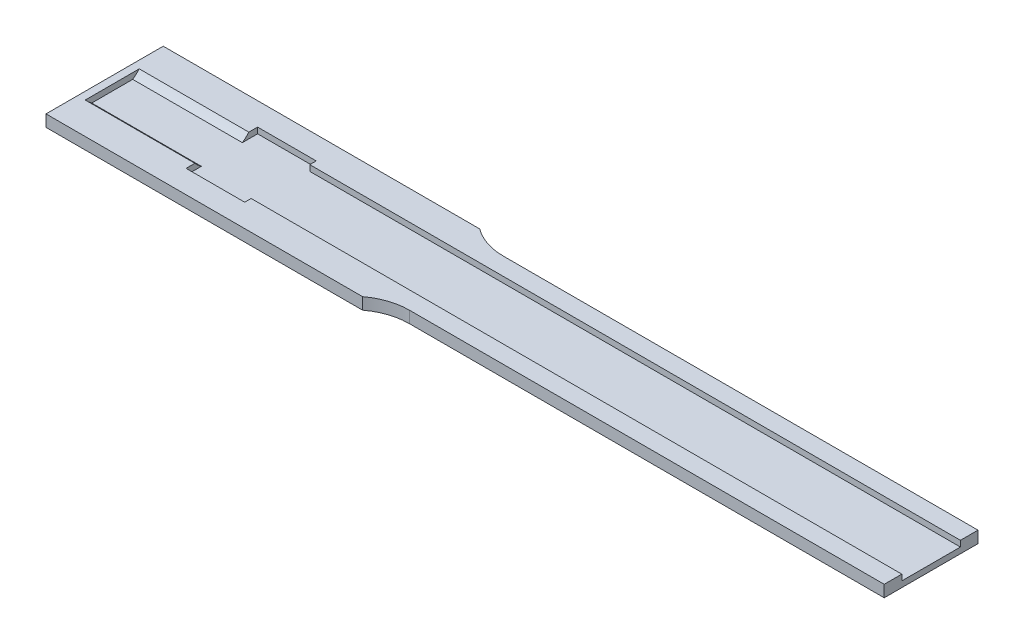
ISO-10303-21;
HEADER;
FILE_DESCRIPTION(('STEP AP214'),'2;1');
FILE_NAME('part.step','',(''),(''),'','','');
FILE_SCHEMA(('AUTOMOTIVE_DESIGN { 1 0 10303 214 1 1 1 1 }'));
ENDSEC;
DATA;
#1=APPLICATION_CONTEXT('core data for automotive mechanical design processes');
#2=APPLICATION_PROTOCOL_DEFINITION('international standard','automotive_design',2000,#1);
#3=PRODUCT_CONTEXT('',#1,'mechanical');
#4=PRODUCT('Part','Part','',(#3));
#5=PRODUCT_RELATED_PRODUCT_CATEGORY('part','',(#4));
#6=PRODUCT_DEFINITION_FORMATION('','',#4);
#7=PRODUCT_DEFINITION_CONTEXT('part definition',#1,'design');
#8=PRODUCT_DEFINITION('design','',#6,#7);
#9=PRODUCT_DEFINITION_SHAPE('','',#8);
#10=(LENGTH_UNIT() NAMED_UNIT(*) SI_UNIT(.MILLI.,.METRE.));
#11=(NAMED_UNIT(*) PLANE_ANGLE_UNIT() SI_UNIT($,.RADIAN.));
#12=(NAMED_UNIT(*) SI_UNIT($,.STERADIAN.) SOLID_ANGLE_UNIT());
#13=UNCERTAINTY_MEASURE_WITH_UNIT(LENGTH_MEASURE(1.E-05),#10,'distance_accuracy_value','');
#14=(GEOMETRIC_REPRESENTATION_CONTEXT(3) GLOBAL_UNCERTAINTY_ASSIGNED_CONTEXT((#13)) GLOBAL_UNIT_ASSIGNED_CONTEXT((#10,
#11,#12)) REPRESENTATION_CONTEXT('',''));
#15=CARTESIAN_POINT('',(0.,0.,0.));
#16=DIRECTION('',(0.,0.,1.));
#17=DIRECTION('',(1.,0.,0.));
#18=AXIS2_PLACEMENT_3D('',#15,#16,#17);
#19=CARTESIAN_POINT('',(0.,6.,0.));
#20=DIRECTION('',(1.,0.,0.));
#21=DIRECTION('',(0.,0.,-1.));
#22=AXIS2_PLACEMENT_3D('',#19,#20,#21);
#23=PLANE('',#22);
#24=DIRECTION('',(0.,0.,1.));
#25=VECTOR('',#24,1.);
#26=CARTESIAN_POINT('',(0.,-6.,10.));
#27=LINE('',#26,#25);
#28=CARTESIAN_POINT('',(0.,-6.,-10.));
#29=VERTEX_POINT('',#28);
#30=CARTESIAN_POINT('',(0.,-6.,10.));
#31=VERTEX_POINT('',#30);
#32=EDGE_CURVE('E185',#29,#31,#27,.T.);
#33=ORIENTED_EDGE('',*,*,#32,.T.);
#34=DIRECTION('',(0.,-1.,0.));
#35=VECTOR('',#34,1.);
#36=CARTESIAN_POINT('',(0.,6.,10.));
#37=LINE('',#36,#35);
#38=CARTESIAN_POINT('',(0.,-4.,10.));
#39=VERTEX_POINT('',#38);
#40=EDGE_CURVE('E196',#39,#31,#37,.T.);
#41=ORIENTED_EDGE('',*,*,#40,.F.);
#42=DIRECTION('',(0.,0.,1.));
#43=VECTOR('',#42,1.);
#44=CARTESIAN_POINT('',(0.,-4.,0.));
#45=LINE('',#44,#43);
#46=CARTESIAN_POINT('',(0.,-4.,-10.));
#47=VERTEX_POINT('',#46);
#48=EDGE_CURVE('E194',#47,#39,#45,.T.);
#49=ORIENTED_EDGE('',*,*,#48,.F.);
#50=DIRECTION('',(0.,-1.,0.));
#51=VECTOR('',#50,1.);
#52=CARTESIAN_POINT('',(0.,6.,-10.));
#53=LINE('',#52,#51);
#54=EDGE_CURVE('E179',#47,#29,#53,.T.);
#55=ORIENTED_EDGE('',*,*,#54,.T.);
#56=EDGE_LOOP('',(#33,#41,#49,#55));
#57=FACE_BOUND('',#56,.T.);
#58=ADVANCED_FACE('F38',(#57),#23,.F.);
#59=CARTESIAN_POINT('',(0.,6.,10.));
#60=DIRECTION('',(0.,0.,1.));
#61=DIRECTION('',(1.,0.,0.));
#62=AXIS2_PLACEMENT_3D('',#59,#60,#61);
#63=PLANE('',#62);
#64=ORIENTED_EDGE('',*,*,#40,.T.);
#65=DIRECTION('',(-1.,0.,0.));
#66=VECTOR('',#65,1.);
#67=CARTESIAN_POINT('',(0.,-6.,10.));
#68=LINE('',#67,#66);
#69=CARTESIAN_POINT('',(54.,-6.,10.));
#70=VERTEX_POINT('',#69);
#71=EDGE_CURVE('E188',#70,#31,#68,.T.);
#72=ORIENTED_EDGE('',*,*,#71,.F.);
#73=DIRECTION('',(0.,1.,0.));
#74=VECTOR('',#73,1.);
#75=CARTESIAN_POINT('',(54.,-8.001,10.));
#76=LINE('',#75,#74);
#77=CARTESIAN_POINT('',(54.,-4.,10.));
#78=VERTEX_POINT('',#77);
#79=EDGE_CURVE('E219',#70,#78,#76,.T.);
#80=ORIENTED_EDGE('',*,*,#79,.T.);
#81=DIRECTION('',(-1.,0.,0.));
#82=VECTOR('',#81,1.);
#83=CARTESIAN_POINT('',(141.,-4.,10.));
#84=LINE('',#83,#82);
#85=EDGE_CURVE('E354',#78,#39,#84,.T.);
#86=ORIENTED_EDGE('',*,*,#85,.T.);
#87=EDGE_LOOP('',(#64,#72,#80,#86));
#88=FACE_BOUND('',#87,.T.);
#89=ADVANCED_FACE('F217',(#88),#63,.T.);
#90=CARTESIAN_POINT('',(0.,6.,-10.));
#91=DIRECTION('',(0.,0.,-1.));
#92=DIRECTION('',(-1.,0.,0.));
#93=AXIS2_PLACEMENT_3D('',#90,#91,#92);
#94=PLANE('',#93);
#95=DIRECTION('',(1.,0.,0.));
#96=VECTOR('',#95,1.);
#97=CARTESIAN_POINT('',(0.,-6.,-10.));
#98=LINE('',#97,#96);
#99=CARTESIAN_POINT('',(54.,-6.,-10.));
#100=VERTEX_POINT('',#99);
#101=EDGE_CURVE('E174',#29,#100,#98,.T.);
#102=ORIENTED_EDGE('',*,*,#101,.F.);
#103=ORIENTED_EDGE('',*,*,#54,.F.);
#104=DIRECTION('',(-1.,0.,0.));
#105=VECTOR('',#104,1.);
#106=CARTESIAN_POINT('',(141.,-4.,-10.));
#107=LINE('',#106,#105);
#108=CARTESIAN_POINT('',(54.,-4.,-10.));
#109=VERTEX_POINT('',#108);
#110=EDGE_CURVE('E352',#109,#47,#107,.T.);
#111=ORIENTED_EDGE('',*,*,#110,.F.);
#112=DIRECTION('',(0.,1.,0.));
#113=VECTOR('',#112,1.);
#114=CARTESIAN_POINT('',(54.,-8.001,-10.));
#115=LINE('',#114,#113);
#116=EDGE_CURVE('E181',#100,#109,#115,.T.);
#117=ORIENTED_EDGE('',*,*,#116,.F.);
#118=EDGE_LOOP('',(#102,#103,#111,#117));
#119=FACE_BOUND('',#118,.T.);
#120=ADVANCED_FACE('F176',(#119),#94,.T.);
#121=CARTESIAN_POINT('',(30.,0.,0.));
#122=DIRECTION('',(-1.,0.,0.));
#123=DIRECTION('',(0.,0.,1.));
#124=AXIS2_PLACEMENT_3D('',#121,#122,#123);
#125=PLANE('',#124);
#126=DIRECTION('',(0.,-1.,0.));
#127=VECTOR('',#126,1.);
#128=CARTESIAN_POINT('',(30.,-1.,-5.));
#129=LINE('',#128,#127);
#130=CARTESIAN_POINT('',(30.,-4.,-5.));
#131=VERTEX_POINT('',#130);
#132=CARTESIAN_POINT('',(30.,-5.,-5.));
#133=VERTEX_POINT('',#132);
#134=EDGE_CURVE('E317',#131,#133,#129,.T.);
#135=ORIENTED_EDGE('',*,*,#134,.F.);
#136=DIRECTION('',(0.,0.,-1.));
#137=VECTOR('',#136,1.);
#138=CARTESIAN_POINT('',(30.,-4.,0.));
#139=LINE('',#138,#137);
#140=CARTESIAN_POINT('',(30.,-4.,-6.1));
#141=VERTEX_POINT('',#140);
#142=EDGE_CURVE('E52',#131,#141,#139,.T.);
#143=ORIENTED_EDGE('',*,*,#142,.T.);
#144=DIRECTION('',(0.,-1.,0.));
#145=VECTOR('',#144,1.);
#146=CARTESIAN_POINT('',(30.,6.,-6.1));
#147=LINE('',#146,#145);
#148=CARTESIAN_POINT('',(30.,-5.,-6.1));
#149=VERTEX_POINT('',#148);
#150=EDGE_CURVE('E244',#141,#149,#147,.T.);
#151=ORIENTED_EDGE('',*,*,#150,.T.);
#152=DIRECTION('',(0.,0.,1.));
#153=VECTOR('',#152,1.);
#154=CARTESIAN_POINT('',(30.,-5.,-6.1));
#155=LINE('',#154,#153);
#156=EDGE_CURVE('E248',#149,#133,#155,.T.);
#157=ORIENTED_EDGE('',*,*,#156,.T.);
#158=EDGE_LOOP('',(#135,#143,#151,#157));
#159=FACE_BOUND('',#158,.T.);
#160=ADVANCED_FACE('F393',(#159),#125,.T.);
#161=CARTESIAN_POINT('',(1.3,0.,0.));
#162=DIRECTION('',(1.,0.,0.));
#163=DIRECTION('',(0.,0.,-1.));
#164=AXIS2_PLACEMENT_3D('',#161,#162,#163);
#165=PLANE('',#164);
#166=CARTESIAN_POINT('',(1.3,0.,0.));
#167=DIRECTION('',(1.,0.,0.));
#168=DIRECTION('',(0.,0.,-1.));
#169=AXIS2_PLACEMENT_3D('',#166,#167,#168);
#170=CIRCLE('',#169,6.09999999999998);
#171=CARTESIAN_POINT('',(1.3,-5.,-3.49428104193123));
#172=VERTEX_POINT('',#171);
#173=CARTESIAN_POINT('',(1.3,-4.,-4.60543157586778));
#174=VERTEX_POINT('',#173);
#175=EDGE_CURVE('E234',#172,#174,#170,.T.);
#176=ORIENTED_EDGE('',*,*,#175,.T.);
#177=DIRECTION('',(0.,0.,1.));
#178=VECTOR('',#177,1.);
#179=CARTESIAN_POINT('',(1.3,-4.,0.));
#180=LINE('',#179,#178);
#181=CARTESIAN_POINT('',(1.3,-4.,4.60543157586776));
#182=VERTEX_POINT('',#181);
#183=EDGE_CURVE('E365',#174,#182,#180,.T.);
#184=ORIENTED_EDGE('',*,*,#183,.T.);
#185=CARTESIAN_POINT('',(1.3,0.,0.));
#186=DIRECTION('',(1.,0.,0.));
#187=DIRECTION('',(0.,0.,-1.));
#188=AXIS2_PLACEMENT_3D('',#185,#186,#187);
#189=CIRCLE('',#188,6.09999999999998);
#190=CARTESIAN_POINT('',(1.3,-5.,3.49428104193123));
#191=VERTEX_POINT('',#190);
#192=EDGE_CURVE('E237',#182,#191,#189,.T.);
#193=ORIENTED_EDGE('',*,*,#192,.T.);
#194=DIRECTION('',(0.,0.,-1.));
#195=VECTOR('',#194,1.);
#196=CARTESIAN_POINT('',(1.3,-5.,-3.49428104193123));
#197=LINE('',#196,#195);
#198=EDGE_CURVE('E240',#191,#172,#197,.T.);
#199=ORIENTED_EDGE('',*,*,#198,.T.);
#200=EDGE_LOOP('',(#176,#184,#193,#199));
#201=FACE_BOUND('',#200,.T.);
#202=ADVANCED_FACE('F373',(#201),#165,.T.);
#203=CARTESIAN_POINT('',(141.,6.,0.));
#204=DIRECTION('',(1.,0.,0.));
#205=DIRECTION('',(0.,0.,-1.));
#206=AXIS2_PLACEMENT_3D('',#203,#204,#205);
#207=PLANE('',#206);
#208=DIRECTION('',(0.,1.,0.));
#209=VECTOR('',#208,1.);
#210=CARTESIAN_POINT('',(141.,-8.001,-8.));
#211=LINE('',#210,#209);
#212=CARTESIAN_POINT('',(141.,-6.,-8.));
#213=VERTEX_POINT('',#212);
#214=CARTESIAN_POINT('',(141.,-4.,-8.));
#215=VERTEX_POINT('',#214);
#216=EDGE_CURVE('E238',#213,#215,#211,.T.);
#217=ORIENTED_EDGE('',*,*,#216,.T.);
#218=DIRECTION('',(0.,0.,-1.));
#219=VECTOR('',#218,1.);
#220=CARTESIAN_POINT('',(141.,-4.,-10.));
#221=LINE('',#220,#219);
#222=CARTESIAN_POINT('',(141.,-4.,-5.));
#223=VERTEX_POINT('',#222);
#224=EDGE_CURVE('E192',#223,#215,#221,.T.);
#225=ORIENTED_EDGE('',*,*,#224,.F.);
#226=DIRECTION('',(0.,-1.,0.));
#227=VECTOR('',#226,1.);
#228=CARTESIAN_POINT('',(141.,-1.,-5.));
#229=LINE('',#228,#227);
#230=CARTESIAN_POINT('',(141.,-5.,-5.));
#231=VERTEX_POINT('',#230);
#232=EDGE_CURVE('E318',#223,#231,#229,.T.);
#233=ORIENTED_EDGE('',*,*,#232,.T.);
#234=DIRECTION('',(0.,0.,1.));
#235=VECTOR('',#234,1.);
#236=CARTESIAN_POINT('',(141.,-5.,-5.));
#237=LINE('',#236,#235);
#238=CARTESIAN_POINT('',(141.,-5.,5.));
#239=VERTEX_POINT('',#238);
#240=EDGE_CURVE('E320',#231,#239,#237,.T.);
#241=ORIENTED_EDGE('',*,*,#240,.T.);
#242=DIRECTION('',(0.,1.,0.));
#243=VECTOR('',#242,1.);
#244=CARTESIAN_POINT('',(141.,-5.,5.));
#245=LINE('',#244,#243);
#246=CARTESIAN_POINT('',(141.,-4.,5.));
#247=VERTEX_POINT('',#246);
#248=EDGE_CURVE('E296',#239,#247,#245,.T.);
#249=ORIENTED_EDGE('',*,*,#248,.T.);
#250=CARTESIAN_POINT('',(141.,-4.,8.));
#251=VERTEX_POINT('',#250);
#252=EDGE_CURVE('E283',#251,#247,#221,.T.);
#253=ORIENTED_EDGE('',*,*,#252,.F.);
#254=DIRECTION('',(0.,1.,0.));
#255=VECTOR('',#254,1.);
#256=CARTESIAN_POINT('',(141.,-8.001,8.));
#257=LINE('',#256,#255);
#258=CARTESIAN_POINT('',(141.,-6.,8.));
#259=VERTEX_POINT('',#258);
#260=EDGE_CURVE('E226',#259,#251,#257,.T.);
#261=ORIENTED_EDGE('',*,*,#260,.F.);
#262=DIRECTION('',(0.,0.,1.));
#263=VECTOR('',#262,1.);
#264=CARTESIAN_POINT('',(141.,-6.,0.));
#265=LINE('',#264,#263);
#266=EDGE_CURVE('E182',#213,#259,#265,.T.);
#267=ORIENTED_EDGE('',*,*,#266,.F.);
#268=EDGE_LOOP('',(#217,#225,#233,#241,#249,#253,#261,#267));
#269=FACE_BOUND('',#268,.T.);
#270=ADVANCED_FACE('F279',(#269),#207,.T.);
#271=CARTESIAN_POINT('',(20.,0.,0.));
#272=DIRECTION('',(-1.,0.,0.));
#273=DIRECTION('',(0.,0.,1.));
#274=AXIS2_PLACEMENT_3D('',#271,#272,#273);
#275=CYLINDRICAL_SURFACE('',#274,6.1);
#276=DIRECTION('',(-1.,0.,0.));
#277=VECTOR('',#276,1.);
#278=CARTESIAN_POINT('',(20.,-4.,-4.60543157586778));
#279=LINE('',#278,#277);
#280=CARTESIAN_POINT('',(20.,-4.,-4.60543157586778));
#281=VERTEX_POINT('',#280);
#282=EDGE_CURVE('E363',#174,#281,#279,.F.);
#283=ORIENTED_EDGE('',*,*,#282,.F.);
#284=ORIENTED_EDGE('',*,*,#175,.F.);
#285=DIRECTION('',(-1.,0.,0.));
#286=VECTOR('',#285,1.);
#287=CARTESIAN_POINT('',(20.,-5.,-3.49428104193123));
#288=LINE('',#287,#286);
#289=CARTESIAN_POINT('',(20.,-5.,-3.49428104193123));
#290=VERTEX_POINT('',#289);
#291=EDGE_CURVE('E272',#290,#172,#288,.T.);
#292=ORIENTED_EDGE('',*,*,#291,.F.);
#293=CARTESIAN_POINT('',(20.,0.,0.));
#294=DIRECTION('',(-1.,0.,0.));
#295=DIRECTION('',(0.,0.,1.));
#296=AXIS2_PLACEMENT_3D('',#293,#294,#295);
#297=CIRCLE('',#296,6.1);
#298=EDGE_CURVE('E265',#281,#290,#297,.T.);
#299=ORIENTED_EDGE('',*,*,#298,.F.);
#300=EDGE_LOOP('',(#283,#284,#292,#299));
#301=FACE_BOUND('',#300,.T.);
#302=ADVANCED_FACE('F381',(#301),#275,.F.);
#303=CARTESIAN_POINT('',(20.,0.,-6.1));
#304=DIRECTION('',(0.,0.,-1.));
#305=DIRECTION('',(-1.,0.,0.));
#306=AXIS2_PLACEMENT_3D('',#303,#304,#305);
#307=PLANE('',#306);
#308=DIRECTION('',(1.,0.,0.));
#309=VECTOR('',#308,1.);
#310=CARTESIAN_POINT('',(20.,-4.,-6.1));
#311=LINE('',#310,#309);
#312=CARTESIAN_POINT('',(20.,-4.,-6.1));
#313=VERTEX_POINT('',#312);
#314=EDGE_CURVE('E359',#313,#141,#311,.T.);
#315=ORIENTED_EDGE('',*,*,#314,.F.);
#316=DIRECTION('',(0.,-1.,0.));
#317=VECTOR('',#316,1.);
#318=CARTESIAN_POINT('',(20.,6.,-6.1));
#319=LINE('',#318,#317);
#320=CARTESIAN_POINT('',(20.,-5.,-6.1));
#321=VERTEX_POINT('',#320);
#322=EDGE_CURVE('E243',#313,#321,#319,.T.);
#323=ORIENTED_EDGE('',*,*,#322,.T.);
#324=DIRECTION('',(-1.,0.,0.));
#325=VECTOR('',#324,1.);
#326=CARTESIAN_POINT('',(30.,-5.,-6.1));
#327=LINE('',#326,#325);
#328=EDGE_CURVE('E254',#149,#321,#327,.T.);
#329=ORIENTED_EDGE('',*,*,#328,.F.);
#330=ORIENTED_EDGE('',*,*,#150,.F.);
#331=EDGE_LOOP('',(#315,#323,#329,#330));
#332=FACE_BOUND('',#331,.T.);
#333=ADVANCED_FACE('F389',(#332),#307,.F.);
#334=CARTESIAN_POINT('',(20.,6.,6.1));
#335=DIRECTION('',(0.,0.,1.));
#336=DIRECTION('',(1.,0.,0.));
#337=AXIS2_PLACEMENT_3D('',#334,#335,#336);
#338=PLANE('',#337);
#339=DIRECTION('',(-1.,0.,0.));
#340=VECTOR('',#339,1.);
#341=CARTESIAN_POINT('',(20.,-4.,6.1));
#342=LINE('',#341,#340);
#343=CARTESIAN_POINT('',(30.,-4.,6.1));
#344=VERTEX_POINT('',#343);
#345=CARTESIAN_POINT('',(20.,-4.,6.1));
#346=VERTEX_POINT('',#345);
#347=EDGE_CURVE('E343',#344,#346,#342,.T.);
#348=ORIENTED_EDGE('',*,*,#347,.F.);
#349=DIRECTION('',(0.,1.,0.));
#350=VECTOR('',#349,1.);
#351=CARTESIAN_POINT('',(30.,-5.,6.1));
#352=LINE('',#351,#350);
#353=CARTESIAN_POINT('',(30.,-5.,6.1));
#354=VERTEX_POINT('',#353);
#355=EDGE_CURVE('E251',#354,#344,#352,.T.);
#356=ORIENTED_EDGE('',*,*,#355,.F.);
#357=DIRECTION('',(-1.,0.,0.));
#358=VECTOR('',#357,1.);
#359=CARTESIAN_POINT('',(30.,-5.,6.1));
#360=LINE('',#359,#358);
#361=CARTESIAN_POINT('',(20.,-5.,6.1));
#362=VERTEX_POINT('',#361);
#363=EDGE_CURVE('E262',#354,#362,#360,.T.);
#364=ORIENTED_EDGE('',*,*,#363,.T.);
#365=DIRECTION('',(0.,1.,0.));
#366=VECTOR('',#365,1.);
#367=CARTESIAN_POINT('',(20.,-5.,6.1));
#368=LINE('',#367,#366);
#369=EDGE_CURVE('E247',#362,#346,#368,.T.);
#370=ORIENTED_EDGE('',*,*,#369,.T.);
#371=EDGE_LOOP('',(#348,#356,#364,#370));
#372=FACE_BOUND('',#371,.T.);
#373=ADVANCED_FACE('F342',(#372),#338,.F.);
#374=CARTESIAN_POINT('',(20.,0.,0.));
#375=DIRECTION('',(-1.,0.,0.));
#376=DIRECTION('',(0.,0.,1.));
#377=AXIS2_PLACEMENT_3D('',#374,#375,#376);
#378=CYLINDRICAL_SURFACE('',#377,6.1);
#379=DIRECTION('',(-1.,0.,0.));
#380=VECTOR('',#379,1.);
#381=CARTESIAN_POINT('',(20.,-4.,4.60543157586778));
#382=LINE('',#381,#380);
#383=CARTESIAN_POINT('',(20.,-4.,4.60543157586778));
#384=VERTEX_POINT('',#383);
#385=EDGE_CURVE('E348',#384,#182,#382,.T.);
#386=ORIENTED_EDGE('',*,*,#385,.F.);
#387=CARTESIAN_POINT('',(20.,0.,0.));
#388=DIRECTION('',(-1.,0.,0.));
#389=DIRECTION('',(0.,0.,1.));
#390=AXIS2_PLACEMENT_3D('',#387,#388,#389);
#391=CIRCLE('',#390,6.1);
#392=CARTESIAN_POINT('',(20.,-5.,3.49428104193123));
#393=VERTEX_POINT('',#392);
#394=EDGE_CURVE('E269',#393,#384,#391,.T.);
#395=ORIENTED_EDGE('',*,*,#394,.F.);
#396=DIRECTION('',(-1.,0.,0.));
#397=VECTOR('',#396,1.);
#398=CARTESIAN_POINT('',(20.,-5.,3.49428104193123));
#399=LINE('',#398,#397);
#400=EDGE_CURVE('E220',#393,#191,#399,.T.);
#401=ORIENTED_EDGE('',*,*,#400,.T.);
#402=ORIENTED_EDGE('',*,*,#192,.F.);
#403=EDGE_LOOP('',(#386,#395,#401,#402));
#404=FACE_BOUND('',#403,.T.);
#405=ADVANCED_FACE('F375',(#404),#378,.F.);
#406=CARTESIAN_POINT('',(20.,0.,0.));
#407=DIRECTION('',(-1.,0.,0.));
#408=DIRECTION('',(0.,0.,1.));
#409=AXIS2_PLACEMENT_3D('',#406,#407,#408);
#410=PLANE('',#409);
#411=DIRECTION('',(0.,0.,-1.));
#412=VECTOR('',#411,1.);
#413=CARTESIAN_POINT('',(20.,-4.,0.));
#414=LINE('',#413,#412);
#415=EDGE_CURVE('E361',#281,#313,#414,.T.);
#416=ORIENTED_EDGE('',*,*,#415,.F.);
#417=ORIENTED_EDGE('',*,*,#298,.T.);
#418=DIRECTION('',(0.,0.,1.));
#419=VECTOR('',#418,1.);
#420=CARTESIAN_POINT('',(20.,-5.,-6.1));
#421=LINE('',#420,#419);
#422=EDGE_CURVE('E257',#321,#290,#421,.T.);
#423=ORIENTED_EDGE('',*,*,#422,.F.);
#424=ORIENTED_EDGE('',*,*,#322,.F.);
#425=EDGE_LOOP('',(#416,#417,#423,#424));
#426=FACE_BOUND('',#425,.T.);
#427=ADVANCED_FACE('F386',(#426),#410,.F.);
#428=DIRECTION('',(0.,0.,-1.));
#429=VECTOR('',#428,1.);
#430=CARTESIAN_POINT('',(20.,-4.,0.));
#431=LINE('',#430,#429);
#432=EDGE_CURVE('E345',#346,#384,#431,.T.);
#433=ORIENTED_EDGE('',*,*,#432,.F.);
#434=ORIENTED_EDGE('',*,*,#369,.F.);
#435=EDGE_CURVE('E256',#393,#362,#421,.T.);
#436=ORIENTED_EDGE('',*,*,#435,.F.);
#437=ORIENTED_EDGE('',*,*,#394,.T.);
#438=EDGE_LOOP('',(#433,#434,#436,#437));
#439=FACE_BOUND('',#438,.T.);
#440=ADVANCED_FACE('F404',(#439),#410,.F.);
#441=ORIENTED_EDGE('',*,*,#355,.T.);
#442=DIRECTION('',(0.,0.,-1.));
#443=VECTOR('',#442,1.);
#444=CARTESIAN_POINT('',(30.,-4.,0.));
#445=LINE('',#444,#443);
#446=CARTESIAN_POINT('',(30.,-4.,5.));
#447=VERTEX_POINT('',#446);
#448=EDGE_CURVE('E333',#344,#447,#445,.T.);
#449=ORIENTED_EDGE('',*,*,#448,.T.);
#450=DIRECTION('',(0.,1.,0.));
#451=VECTOR('',#450,1.);
#452=CARTESIAN_POINT('',(30.,-5.,5.));
#453=LINE('',#452,#451);
#454=CARTESIAN_POINT('',(30.,-5.,5.));
#455=VERTEX_POINT('',#454);
#456=EDGE_CURVE('E299',#455,#447,#453,.T.);
#457=ORIENTED_EDGE('',*,*,#456,.F.);
#458=EDGE_CURVE('E246',#455,#354,#155,.T.);
#459=ORIENTED_EDGE('',*,*,#458,.T.);
#460=EDGE_LOOP('',(#441,#449,#457,#459));
#461=FACE_BOUND('',#460,.T.);
#462=ADVANCED_FACE('F331',(#461),#125,.T.);
#463=CARTESIAN_POINT('',(54.,-8.001,8.));
#464=DIRECTION('',(0.,0.,-1.));
#465=DIRECTION('',(-1.,0.,0.));
#466=AXIS2_PLACEMENT_3D('',#463,#464,#465);
#467=PLANE('',#466);
#468=DIRECTION('',(1.,0.,0.));
#469=VECTOR('',#468,1.);
#470=CARTESIAN_POINT('',(54.,-4.,8.));
#471=LINE('',#470,#469);
#472=CARTESIAN_POINT('',(60.,-4.,7.99999999999999));
#473=VERTEX_POINT('',#472);
#474=EDGE_CURVE('E287',#473,#251,#471,.T.);
#475=ORIENTED_EDGE('',*,*,#474,.F.);
#476=DIRECTION('',(0.,1.,0.));
#477=VECTOR('',#476,1.);
#478=CARTESIAN_POINT('',(60.,-8.001,8.));
#479=LINE('',#478,#477);
#480=CARTESIAN_POINT('',(60.,-6.,8.));
#481=VERTEX_POINT('',#480);
#482=EDGE_CURVE('E202',#473,#481,#479,.F.);
#483=ORIENTED_EDGE('',*,*,#482,.T.);
#484=DIRECTION('',(1.,0.,0.));
#485=VECTOR('',#484,1.);
#486=CARTESIAN_POINT('',(54.,-6.,8.));
#487=LINE('',#486,#485);
#488=EDGE_CURVE('E211',#481,#259,#487,.T.);
#489=ORIENTED_EDGE('',*,*,#488,.T.);
#490=ORIENTED_EDGE('',*,*,#260,.T.);
#491=EDGE_LOOP('',(#475,#483,#489,#490));
#492=FACE_BOUND('',#491,.T.);
#493=ADVANCED_FACE('F286',(#492),#467,.F.);
#494=CARTESIAN_POINT('',(54.,-8.001,-8.));
#495=DIRECTION('',(0.,0.,1.));
#496=DIRECTION('',(1.,0.,0.));
#497=AXIS2_PLACEMENT_3D('',#494,#495,#496);
#498=PLANE('',#497);
#499=DIRECTION('',(-1.,0.,0.));
#500=VECTOR('',#499,1.);
#501=CARTESIAN_POINT('',(54.,-4.,-8.));
#502=LINE('',#501,#500);
#503=CARTESIAN_POINT('',(60.,-4.,-7.99999999999999));
#504=VERTEX_POINT('',#503);
#505=EDGE_CURVE('E309',#215,#504,#502,.T.);
#506=ORIENTED_EDGE('',*,*,#505,.F.);
#507=ORIENTED_EDGE('',*,*,#216,.F.);
#508=DIRECTION('',(-1.,0.,0.));
#509=VECTOR('',#508,1.);
#510=CARTESIAN_POINT('',(54.,-6.,-8.));
#511=LINE('',#510,#509);
#512=CARTESIAN_POINT('',(60.,-6.,-8.));
#513=VERTEX_POINT('',#512);
#514=EDGE_CURVE('E225',#213,#513,#511,.T.);
#515=ORIENTED_EDGE('',*,*,#514,.T.);
#516=DIRECTION('',(0.,-1.,0.));
#517=VECTOR('',#516,1.);
#518=CARTESIAN_POINT('',(60.,-8.001,-8.));
#519=LINE('',#518,#517);
#520=EDGE_CURVE('E204',#513,#504,#519,.F.);
#521=ORIENTED_EDGE('',*,*,#520,.T.);
#522=EDGE_LOOP('',(#506,#507,#515,#521));
#523=FACE_BOUND('',#522,.T.);
#524=ADVANCED_FACE('F308',(#523),#498,.F.);
#525=CARTESIAN_POINT('',(60.,-8.001,18.));
#526=DIRECTION('',(0.,1.,0.));
#527=DIRECTION('',(0.,0.,1.));
#528=AXIS2_PLACEMENT_3D('',#525,#526,#527);
#529=CYLINDRICAL_SURFACE('',#528,10.);
#530=CARTESIAN_POINT('',(60.,-4.,18.));
#531=DIRECTION('',(0.,1.,0.));
#532=DIRECTION('',(0.,0.,1.));
#533=AXIS2_PLACEMENT_3D('',#530,#531,#532);
#534=CIRCLE('',#533,10.);
#535=EDGE_CURVE('E224',#78,#473,#534,.F.);
#536=ORIENTED_EDGE('',*,*,#535,.F.);
#537=ORIENTED_EDGE('',*,*,#79,.F.);
#538=CARTESIAN_POINT('',(60.,-6.,18.));
#539=DIRECTION('',(0.,1.,0.));
#540=DIRECTION('',(0.,0.,1.));
#541=AXIS2_PLACEMENT_3D('',#538,#539,#540);
#542=CIRCLE('',#541,10.);
#543=EDGE_CURVE('E207',#481,#70,#542,.T.);
#544=ORIENTED_EDGE('',*,*,#543,.F.);
#545=ORIENTED_EDGE('',*,*,#482,.F.);
#546=EDGE_LOOP('',(#536,#537,#544,#545));
#547=FACE_BOUND('',#546,.T.);
#548=ADVANCED_FACE('F223',(#547),#529,.F.);
#549=CARTESIAN_POINT('',(60.,-8.001,-18.));
#550=DIRECTION('',(0.,-1.,0.));
#551=DIRECTION('',(0.,0.,-1.));
#552=AXIS2_PLACEMENT_3D('',#549,#550,#551);
#553=CYLINDRICAL_SURFACE('',#552,10.);
#554=CARTESIAN_POINT('',(60.,-4.,-18.));
#555=DIRECTION('',(0.,1.,0.));
#556=DIRECTION('',(0.,0.,1.));
#557=AXIS2_PLACEMENT_3D('',#554,#555,#556);
#558=CIRCLE('',#557,10.);
#559=EDGE_CURVE('E305',#504,#109,#558,.F.);
#560=ORIENTED_EDGE('',*,*,#559,.F.);
#561=ORIENTED_EDGE('',*,*,#520,.F.);
#562=CARTESIAN_POINT('',(60.,-6.,-18.));
#563=DIRECTION('',(0.,1.,0.));
#564=DIRECTION('',(0.,0.,1.));
#565=AXIS2_PLACEMENT_3D('',#562,#563,#564);
#566=CIRCLE('',#565,10.);
#567=EDGE_CURVE('E46',#100,#513,#566,.T.);
#568=ORIENTED_EDGE('',*,*,#567,.F.);
#569=ORIENTED_EDGE('',*,*,#116,.T.);
#570=EDGE_LOOP('',(#560,#561,#568,#569));
#571=FACE_BOUND('',#570,.T.);
#572=ADVANCED_FACE('F40',(#571),#553,.F.);
#573=CARTESIAN_POINT('',(141.,-5.,5.));
#574=DIRECTION('',(0.,0.,1.));
#575=DIRECTION('',(0.,-1.,0.));
#576=AXIS2_PLACEMENT_3D('',#573,#574,#575);
#577=PLANE('',#576);
#578=DIRECTION('',(-1.,0.,0.));
#579=VECTOR('',#578,1.);
#580=CARTESIAN_POINT('',(141.,-4.,5.));
#581=LINE('',#580,#579);
#582=EDGE_CURVE('E312',#247,#447,#581,.T.);
#583=ORIENTED_EDGE('',*,*,#582,.F.);
#584=ORIENTED_EDGE('',*,*,#248,.F.);
#585=DIRECTION('',(-1.,0.,0.));
#586=VECTOR('',#585,1.);
#587=CARTESIAN_POINT('',(141.,-5.,5.));
#588=LINE('',#587,#586);
#589=EDGE_CURVE('E288',#239,#455,#588,.T.);
#590=ORIENTED_EDGE('',*,*,#589,.T.);
#591=ORIENTED_EDGE('',*,*,#456,.T.);
#592=EDGE_LOOP('',(#583,#584,#590,#591));
#593=FACE_BOUND('',#592,.T.);
#594=ADVANCED_FACE('F327',(#593),#577,.F.);
#595=CARTESIAN_POINT('',(141.,-1.,-5.));
#596=DIRECTION('',(0.,0.,-1.));
#597=DIRECTION('',(0.,1.,0.));
#598=AXIS2_PLACEMENT_3D('',#595,#596,#597);
#599=PLANE('',#598);
#600=DIRECTION('',(1.,0.,0.));
#601=VECTOR('',#600,1.);
#602=CARTESIAN_POINT('',(141.,-4.,-5.));
#603=LINE('',#602,#601);
#604=EDGE_CURVE('E11',#131,#223,#603,.T.);
#605=ORIENTED_EDGE('',*,*,#604,.F.);
#606=ORIENTED_EDGE('',*,*,#134,.T.);
#607=DIRECTION('',(-1.,0.,0.));
#608=VECTOR('',#607,1.);
#609=CARTESIAN_POINT('',(141.,-5.,-5.));
#610=LINE('',#609,#608);
#611=EDGE_CURVE('E289',#231,#133,#610,.T.);
#612=ORIENTED_EDGE('',*,*,#611,.F.);
#613=ORIENTED_EDGE('',*,*,#232,.F.);
#614=EDGE_LOOP('',(#605,#606,#612,#613));
#615=FACE_BOUND('',#614,.T.);
#616=ADVANCED_FACE('F424',(#615),#599,.F.);
#617=CARTESIAN_POINT('',(0.,-6.,0.));
#618=DIRECTION('',(0.,1.,0.));
#619=DIRECTION('',(0.,0.,1.));
#620=AXIS2_PLACEMENT_3D('',#617,#618,#619);
#621=PLANE('',#620);
#622=ORIENTED_EDGE('',*,*,#71,.T.);
#623=ORIENTED_EDGE('',*,*,#32,.F.);
#624=ORIENTED_EDGE('',*,*,#101,.T.);
#625=ORIENTED_EDGE('',*,*,#567,.T.);
#626=ORIENTED_EDGE('',*,*,#514,.F.);
#627=ORIENTED_EDGE('',*,*,#266,.T.);
#628=ORIENTED_EDGE('',*,*,#488,.F.);
#629=ORIENTED_EDGE('',*,*,#543,.T.);
#630=EDGE_LOOP('',(#622,#623,#624,#625,#626,#627,#628,#629));
#631=FACE_BOUND('',#630,.T.);
#632=ADVANCED_FACE('F186',(#631),#621,.F.);
#633=CARTESIAN_POINT('',(20.,-5.,-3.49428104193123));
#634=DIRECTION('',(0.,-1.,0.));
#635=DIRECTION('',(0.,0.,-1.));
#636=AXIS2_PLACEMENT_3D('',#633,#634,#635);
#637=PLANE('',#636);
#638=ORIENTED_EDGE('',*,*,#291,.T.);
#639=ORIENTED_EDGE('',*,*,#198,.F.);
#640=ORIENTED_EDGE('',*,*,#400,.F.);
#641=ORIENTED_EDGE('',*,*,#435,.T.);
#642=ORIENTED_EDGE('',*,*,#363,.F.);
#643=ORIENTED_EDGE('',*,*,#458,.F.);
#644=ORIENTED_EDGE('',*,*,#589,.F.);
#645=ORIENTED_EDGE('',*,*,#240,.F.);
#646=ORIENTED_EDGE('',*,*,#611,.T.);
#647=ORIENTED_EDGE('',*,*,#156,.F.);
#648=ORIENTED_EDGE('',*,*,#328,.T.);
#649=ORIENTED_EDGE('',*,*,#422,.T.);
#650=EDGE_LOOP('',(#638,#639,#640,#641,#642,#643,#644,#645,#646,#647,#648,#649));
#651=FACE_BOUND('',#650,.T.);
#652=ADVANCED_FACE('F335',(#651),#637,.F.);
#653=CARTESIAN_POINT('',(141.,-4.,-10.));
#654=DIRECTION('',(0.,1.,0.));
#655=DIRECTION('',(0.,0.,1.));
#656=AXIS2_PLACEMENT_3D('',#653,#654,#655);
#657=PLANE('',#656);
#658=ORIENTED_EDGE('',*,*,#110,.T.);
#659=ORIENTED_EDGE('',*,*,#48,.T.);
#660=ORIENTED_EDGE('',*,*,#85,.F.);
#661=ORIENTED_EDGE('',*,*,#535,.T.);
#662=ORIENTED_EDGE('',*,*,#474,.T.);
#663=ORIENTED_EDGE('',*,*,#252,.T.);
#664=ORIENTED_EDGE('',*,*,#582,.T.);
#665=ORIENTED_EDGE('',*,*,#448,.F.);
#666=ORIENTED_EDGE('',*,*,#347,.T.);
#667=ORIENTED_EDGE('',*,*,#432,.T.);
#668=ORIENTED_EDGE('',*,*,#385,.T.);
#669=ORIENTED_EDGE('',*,*,#183,.F.);
#670=ORIENTED_EDGE('',*,*,#282,.T.);
#671=ORIENTED_EDGE('',*,*,#415,.T.);
#672=ORIENTED_EDGE('',*,*,#314,.T.);
#673=ORIENTED_EDGE('',*,*,#142,.F.);
#674=ORIENTED_EDGE('',*,*,#604,.T.);
#675=ORIENTED_EDGE('',*,*,#224,.T.);
#676=ORIENTED_EDGE('',*,*,#505,.T.);
#677=ORIENTED_EDGE('',*,*,#559,.T.);
#678=EDGE_LOOP('',(#658,#659,#660,#661,#662,#663,#664,#665,#666,#667,#668,#669,#670,#671,#672,
#673,#674,#675,#676,#677));
#679=FACE_BOUND('',#678,.T.);
#680=ADVANCED_FACE('F351',(#679),#657,.T.);
#681=CLOSED_SHELL('',(#58,#89,#120,#160,#202,#270,#302,#333,#373,#405,#427,#440,#462,#493,#524,
#548,#572,#594,#616,#632,#652,#680));
#682=MANIFOLD_SOLID_BREP('B2',#681);
#683=ADVANCED_BREP_SHAPE_REPRESENTATION('',(#18,#682),#14);
#684=SHAPE_DEFINITION_REPRESENTATION(#9,#683);
ENDSEC;
END-ISO-10303-21;
